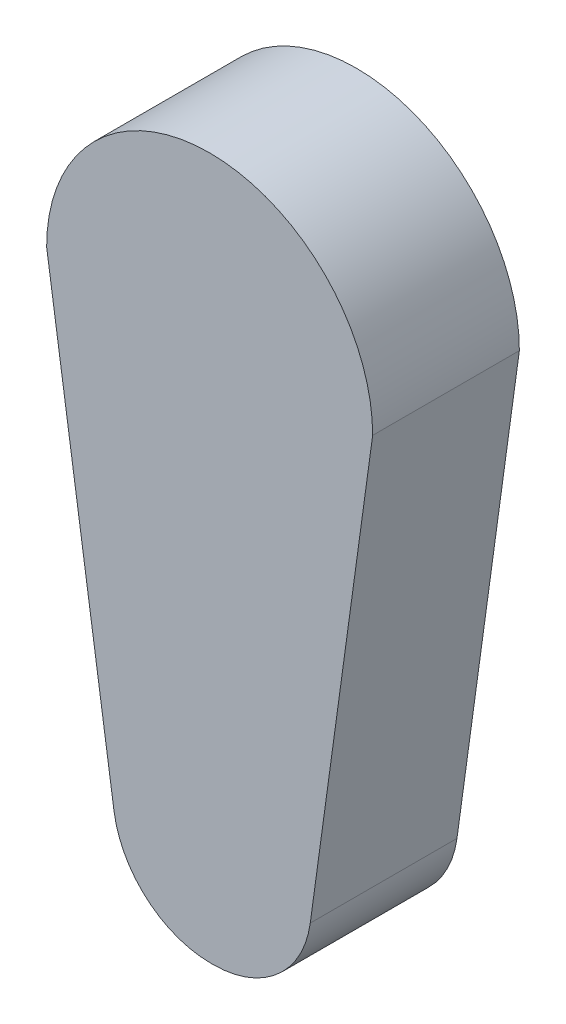
ISO-10303-21;
HEADER;
FILE_DESCRIPTION(('STEP AP214'),'2;1');
FILE_NAME('part.step','',(''),(''),'','','');
FILE_SCHEMA(('AUTOMOTIVE_DESIGN { 1 0 10303 214 1 1 1 1 }'));
ENDSEC;
DATA;
#1=APPLICATION_CONTEXT('core data for automotive mechanical design processes');
#2=APPLICATION_PROTOCOL_DEFINITION('international standard','automotive_design',2000,#1);
#3=PRODUCT_CONTEXT('',#1,'mechanical');
#4=PRODUCT('Part','Part','',(#3));
#5=PRODUCT_RELATED_PRODUCT_CATEGORY('part','',(#4));
#6=PRODUCT_DEFINITION_FORMATION('','',#4);
#7=PRODUCT_DEFINITION_CONTEXT('part definition',#1,'design');
#8=PRODUCT_DEFINITION('design','',#6,#7);
#9=PRODUCT_DEFINITION_SHAPE('','',#8);
#10=(LENGTH_UNIT() NAMED_UNIT(*) SI_UNIT(.MILLI.,.METRE.));
#11=(NAMED_UNIT(*) PLANE_ANGLE_UNIT() SI_UNIT($,.RADIAN.));
#12=(NAMED_UNIT(*) SI_UNIT($,.STERADIAN.) SOLID_ANGLE_UNIT());
#13=UNCERTAINTY_MEASURE_WITH_UNIT(LENGTH_MEASURE(1.E-05),#10,'distance_accuracy_value','');
#14=(GEOMETRIC_REPRESENTATION_CONTEXT(3) GLOBAL_UNCERTAINTY_ASSIGNED_CONTEXT((#13)) GLOBAL_UNIT_ASSIGNED_CONTEXT((#10,
#11,#12)) REPRESENTATION_CONTEXT('',''));
#15=CARTESIAN_POINT('',(0.,0.,0.));
#16=DIRECTION('',(0.,0.,1.));
#17=DIRECTION('',(1.,0.,0.));
#18=AXIS2_PLACEMENT_3D('',#15,#16,#17);
#19=CARTESIAN_POINT('',(-4.93131975717711,6.15468669765734,2.475));
#20=DIRECTION('',(-0.989200897474757,-0.146565972978502,0.));
#21=DIRECTION('',(0.146565972978502,-0.989200897474757,0.));
#22=AXIS2_PLACEMENT_3D('',#19,#20,#21);
#23=PLANE('',#22);
#24=DIRECTION('',(-0.146565972978502,0.989200897474757,0.));
#25=VECTOR('',#24,1.);
#26=CARTESIAN_POINT('',(-4.93131975717711,6.15468669765734,-2.025));
#27=LINE('',#26,#25);
#28=CARTESIAN_POINT('',(-2.97208315950685,-7.06856397502836,-2.025));
#29=VERTEX_POINT('',#28);
#30=CARTESIAN_POINT('',(-5.03872767935279,6.87960265770532,-2.025));
#31=VERTEX_POINT('',#30);
#32=EDGE_CURVE('E181',#29,#31,#27,.T.);
#33=ORIENTED_EDGE('',*,*,#32,.F.);
#34=DIRECTION('',(0.,0.,-1.));
#35=VECTOR('',#34,1.);
#36=CARTESIAN_POINT('',(-2.97208315950685,-7.06856397502835,2.475));
#37=LINE('',#36,#35);
#38=CARTESIAN_POINT('',(-2.97208315950685,-7.06856397502836,2.475));
#39=VERTEX_POINT('',#38);
#40=EDGE_CURVE('E59',#29,#39,#37,.F.);
#41=ORIENTED_EDGE('',*,*,#40,.T.);
#42=DIRECTION('',(-0.146565972978502,0.989200897474757,0.));
#43=VECTOR('',#42,1.);
#44=CARTESIAN_POINT('',(-4.93131975717711,6.15468669765734,2.475));
#45=LINE('',#44,#43);
#46=CARTESIAN_POINT('',(-5.03872767935279,6.87960265770532,2.475));
#47=VERTEX_POINT('',#46);
#48=EDGE_CURVE('E182',#39,#47,#45,.T.);
#49=ORIENTED_EDGE('',*,*,#48,.T.);
#50=DIRECTION('',(0.,0.,-1.));
#51=VECTOR('',#50,1.);
#52=CARTESIAN_POINT('',(-5.03872767935279,6.87960265770532,2.475));
#53=LINE('',#52,#51);
#54=EDGE_CURVE('E190',#47,#31,#53,.T.);
#55=ORIENTED_EDGE('',*,*,#54,.T.);
#56=EDGE_LOOP('',(#33,#41,#49,#55));
#57=FACE_BOUND('',#56,.T.);
#58=ADVANCED_FACE('F36',(#57),#23,.T.);
#59=CARTESIAN_POINT('',(4.8689374188945,6.20456218244334,2.475));
#60=DIRECTION('',(-0.990672395571448,0.136265199712651,0.));
#61=DIRECTION('',(-0.136265199712651,-0.990672395571448,0.));
#62=AXIS2_PLACEMENT_3D('',#59,#60,#61);
#63=PLANE('',#62);
#64=DIRECTION('',(0.136265199712651,0.990672395571448,0.));
#65=VECTOR('',#64,1.);
#66=CARTESIAN_POINT('',(4.8689374188945,6.20456218244334,2.475));
#67=LINE('',#66,#65);
#68=CARTESIAN_POINT('',(3.04749343403466,-7.0376616552308,2.475));
#69=VERTEX_POINT('',#68);
#70=CARTESIAN_POINT('',(4.96127090727384,6.87584317213934,2.475));
#71=VERTEX_POINT('',#70);
#72=EDGE_CURVE('E184',#69,#71,#67,.T.);
#73=ORIENTED_EDGE('',*,*,#72,.F.);
#74=DIRECTION('',(0.,0.,-1.));
#75=VECTOR('',#74,1.);
#76=CARTESIAN_POINT('',(3.04749343403466,-7.0376616552308,2.475));
#77=LINE('',#76,#75);
#78=CARTESIAN_POINT('',(3.04749343403466,-7.0376616552308,-2.025));
#79=VERTEX_POINT('',#78);
#80=EDGE_CURVE('E11',#69,#79,#77,.T.);
#81=ORIENTED_EDGE('',*,*,#80,.T.);
#82=DIRECTION('',(0.136265199712651,0.990672395571448,0.));
#83=VECTOR('',#82,1.);
#84=CARTESIAN_POINT('',(4.8689374188945,6.20456218244334,-2.025));
#85=LINE('',#84,#83);
#86=CARTESIAN_POINT('',(4.96127090727384,6.87584317213934,-2.025));
#87=VERTEX_POINT('',#86);
#88=EDGE_CURVE('E192',#79,#87,#85,.T.);
#89=ORIENTED_EDGE('',*,*,#88,.T.);
#90=DIRECTION('',(0.,0.,-1.));
#91=VECTOR('',#90,1.);
#92=CARTESIAN_POINT('',(4.96127090727384,6.87584317213934,2.475));
#93=LINE('',#92,#91);
#94=EDGE_CURVE('E198',#71,#87,#93,.T.);
#95=ORIENTED_EDGE('',*,*,#94,.F.);
#96=EDGE_LOOP('',(#73,#81,#89,#95));
#97=FACE_BOUND('',#96,.T.);
#98=ADVANCED_FACE('F237',(#97),#63,.F.);
#99=CARTESIAN_POINT('',(-0.0387276793527847,6.87960265770532,2.475));
#100=DIRECTION('',(0.,0.,-1.));
#101=DIRECTION('',(-1.,0.,0.));
#102=AXIS2_PLACEMENT_3D('',#99,#100,#101);
#103=CYLINDRICAL_SURFACE('',#102,5.);
#104=CARTESIAN_POINT('',(-0.0387276793527847,6.87960265770532,-2.025));
#105=DIRECTION('',(0.,0.,1.));
#106=DIRECTION('',(1.,0.,0.));
#107=AXIS2_PLACEMENT_3D('',#104,#105,#106);
#108=CIRCLE('',#107,5.);
#109=EDGE_CURVE('E185',#87,#31,#108,.T.);
#110=ORIENTED_EDGE('',*,*,#109,.T.);
#111=ORIENTED_EDGE('',*,*,#54,.F.);
#112=CARTESIAN_POINT('',(-0.0387276793527847,6.87960265770532,2.475));
#113=DIRECTION('',(0.,0.,1.));
#114=DIRECTION('',(1.,0.,0.));
#115=AXIS2_PLACEMENT_3D('',#112,#113,#114);
#116=CIRCLE('',#115,5.);
#117=EDGE_CURVE('E187',#71,#47,#116,.T.);
#118=ORIENTED_EDGE('',*,*,#117,.F.);
#119=ORIENTED_EDGE('',*,*,#94,.T.);
#120=EDGE_LOOP('',(#110,#111,#118,#119));
#121=FACE_BOUND('',#120,.T.);
#122=ADVANCED_FACE('F233',(#121),#103,.T.);
#123=CARTESIAN_POINT('',(-0.0387276793527847,6.87960265770532,2.475));
#124=DIRECTION('',(0.,0.,1.));
#125=DIRECTION('',(1.,0.,0.));
#126=AXIS2_PLACEMENT_3D('',#123,#124,#125);
#127=PLANE('',#126);
#128=ORIENTED_EDGE('',*,*,#48,.F.);
#129=CARTESIAN_POINT('',(-0.00448046708257516,-6.62886605609285,2.475));
#130=DIRECTION('',(0.,0.,1.));
#131=DIRECTION('',(1.,0.,0.));
#132=AXIS2_PLACEMENT_3D('',#129,#130,#131);
#133=CIRCLE('',#132,3.);
#134=CARTESIAN_POINT('',(-0.00448046708257516,-9.62886605609285,2.475));
#135=VERTEX_POINT('',#134);
#136=EDGE_CURVE('E44',#39,#135,#133,.T.);
#137=ORIENTED_EDGE('',*,*,#136,.T.);
#138=DIRECTION('',(1.,0.,0.));
#139=VECTOR('',#138,1.);
#140=CARTESIAN_POINT('',(2.6917503967597,-9.62886605609285,2.475));
#141=LINE('',#140,#139);
#142=CARTESIAN_POINT('',(0.0754762473203171,-9.62886605609285,2.475));
#143=VERTEX_POINT('',#142);
#144=EDGE_CURVE('E217',#135,#143,#141,.T.);
#145=ORIENTED_EDGE('',*,*,#144,.T.);
#146=CARTESIAN_POINT('',(0.0754762473203171,-6.62886605609285,2.475));
#147=DIRECTION('',(0.,0.,1.));
#148=DIRECTION('',(1.,0.,0.));
#149=AXIS2_PLACEMENT_3D('',#146,#147,#148);
#150=CIRCLE('',#149,3.);
#151=EDGE_CURVE('E51',#143,#69,#150,.T.);
#152=ORIENTED_EDGE('',*,*,#151,.T.);
#153=ORIENTED_EDGE('',*,*,#72,.T.);
#154=ORIENTED_EDGE('',*,*,#117,.T.);
#155=EDGE_LOOP('',(#128,#137,#145,#152,#153,#154));
#156=FACE_BOUND('',#155,.T.);
#157=ADVANCED_FACE('F216',(#156),#127,.T.);
#158=CARTESIAN_POINT('',(-0.0387276793527847,6.87960265770532,-2.025));
#159=DIRECTION('',(0.,0.,1.));
#160=DIRECTION('',(1.,0.,0.));
#161=AXIS2_PLACEMENT_3D('',#158,#159,#160);
#162=PLANE('',#161);
#163=DIRECTION('',(-0.0898786869233803,-0.995952720583125,0.));
#164=VECTOR('',#163,1.);
#165=CARTESIAN_POINT('',(2.77143117718283,4.21576595588987,-2.025));
#166=LINE('',#165,#164);
#167=CARTESIAN_POINT('',(2.77143117718283,4.21576595588987,-2.025));
#168=VERTEX_POINT('',#167);
#169=CARTESIAN_POINT('',(1.6980635868002,-7.67830379992061,-2.025));
#170=VERTEX_POINT('',#169);
#171=EDGE_CURVE('E151',#168,#170,#166,.T.);
#172=ORIENTED_EDGE('',*,*,#171,.F.);
#173=CARTESIAN_POINT('',(-0.0404058570119669,6.41330826108688,-2.025));
#174=DIRECTION('',(0.,0.,-1.));
#175=DIRECTION('',(-1.,0.,0.));
#176=AXIS2_PLACEMENT_3D('',#173,#174,#175);
#177=CIRCLE('',#176,3.5687);
#178=CARTESIAN_POINT('',(-2.85466796517329,4.21887246194228,-2.025));
#179=VERTEX_POINT('',#178);
#180=EDGE_CURVE('E122',#179,#168,#177,.T.);
#181=ORIENTED_EDGE('',*,*,#180,.F.);
#182=DIRECTION('',(-0.0887787822467504,0.99605136806431,0.));
#183=VECTOR('',#182,1.);
#184=CARTESIAN_POINT('',(-1.79443588080235,-7.67637538194224,-2.025));
#185=LINE('',#184,#183);
#186=CARTESIAN_POINT('',(-1.79443588080235,-7.67637538194224,-2.025));
#187=VERTEX_POINT('',#186);
#188=EDGE_CURVE('E139',#187,#179,#185,.T.);
#189=ORIENTED_EDGE('',*,*,#188,.F.);
#190=CARTESIAN_POINT('',(-0.0481861470010723,-7.67733959093142,-2.025));
#191=DIRECTION('',(0.,0.,-1.));
#192=DIRECTION('',(-1.,0.,0.));
#193=AXIS2_PLACEMENT_3D('',#190,#191,#192);
#194=CIRCLE('',#193,1.74625);
#195=EDGE_CURVE('E142',#170,#187,#194,.T.);
#196=ORIENTED_EDGE('',*,*,#195,.F.);
#197=EDGE_LOOP('',(#172,#181,#189,#196));
#198=FACE_BOUND('',#197,.T.);
#199=DIRECTION('',(-1.,0.,0.));
#200=VECTOR('',#199,1.);
#201=CARTESIAN_POINT('',(-0.0387276793527847,-9.62886605609285,-2.025));
#202=LINE('',#201,#200);
#203=CARTESIAN_POINT('',(0.0754762473203171,-9.62886605609285,-2.025));
#204=VERTEX_POINT('',#203);
#205=CARTESIAN_POINT('',(-0.00448046708257516,-9.62886605609285,-2.025));
#206=VERTEX_POINT('',#205);
#207=EDGE_CURVE('E201',#204,#206,#202,.T.);
#208=ORIENTED_EDGE('',*,*,#207,.T.);
#209=CARTESIAN_POINT('',(-0.00448046708257516,-6.62886605609285,-2.025));
#210=DIRECTION('',(0.,0.,1.));
#211=DIRECTION('',(1.,0.,0.));
#212=AXIS2_PLACEMENT_3D('',#209,#210,#211);
#213=CIRCLE('',#212,3.);
#214=EDGE_CURVE('E211',#206,#29,#213,.F.);
#215=ORIENTED_EDGE('',*,*,#214,.T.);
#216=ORIENTED_EDGE('',*,*,#32,.T.);
#217=ORIENTED_EDGE('',*,*,#109,.F.);
#218=ORIENTED_EDGE('',*,*,#88,.F.);
#219=CARTESIAN_POINT('',(0.0754762473203171,-6.62886605609285,-2.025));
#220=DIRECTION('',(0.,0.,1.));
#221=DIRECTION('',(1.,0.,0.));
#222=AXIS2_PLACEMENT_3D('',#219,#220,#221);
#223=CIRCLE('',#222,3.);
#224=EDGE_CURVE('E209',#79,#204,#223,.F.);
#225=ORIENTED_EDGE('',*,*,#224,.T.);
#226=EDGE_LOOP('',(#208,#215,#216,#217,#218,#225));
#227=FACE_BOUND('',#226,.T.);
#228=ADVANCED_FACE('F228',(#198,#227),#162,.F.);
#229=CARTESIAN_POINT('',(-0.0404058570119669,6.41330826108688,0.475));
#230=DIRECTION('',(0.,0.,-1.));
#231=DIRECTION('',(-1.,0.,0.));
#232=AXIS2_PLACEMENT_3D('',#229,#230,#231);
#233=CYLINDRICAL_SURFACE('',#232,3.5687);
#234=ORIENTED_EDGE('',*,*,#180,.T.);
#235=DIRECTION('',(0.,0.,-1.));
#236=VECTOR('',#235,1.);
#237=CARTESIAN_POINT('',(2.77143117718283,4.21576595588987,0.475));
#238=LINE('',#237,#236);
#239=CARTESIAN_POINT('',(2.77143117718283,4.21576595588987,0.475));
#240=VERTEX_POINT('',#239);
#241=EDGE_CURVE('E115',#240,#168,#238,.T.);
#242=ORIENTED_EDGE('',*,*,#241,.F.);
#243=CARTESIAN_POINT('',(-0.0404058570119669,6.41330826108688,0.475));
#244=DIRECTION('',(0.,0.,-1.));
#245=DIRECTION('',(-1.,0.,0.));
#246=AXIS2_PLACEMENT_3D('',#243,#244,#245);
#247=CIRCLE('',#246,3.5687);
#248=CARTESIAN_POINT('',(-2.85466796517329,4.21887246194228,0.475));
#249=VERTEX_POINT('',#248);
#250=EDGE_CURVE('E119',#249,#240,#247,.T.);
#251=ORIENTED_EDGE('',*,*,#250,.F.);
#252=DIRECTION('',(0.,0.,-1.));
#253=VECTOR('',#252,1.);
#254=CARTESIAN_POINT('',(-2.85466796517329,4.21887246194228,0.475));
#255=LINE('',#254,#253);
#256=EDGE_CURVE('E155',#249,#179,#255,.T.);
#257=ORIENTED_EDGE('',*,*,#256,.T.);
#258=EDGE_LOOP('',(#234,#242,#251,#257));
#259=FACE_BOUND('',#258,.T.);
#260=ADVANCED_FACE('F117',(#259),#233,.F.);
#261=CARTESIAN_POINT('',(-1.79443588080235,-7.67637538194224,0.475));
#262=DIRECTION('',(-0.99605136806431,-0.0887787822467504,0.));
#263=DIRECTION('',(0.0887787822467504,-0.99605136806431,0.));
#264=AXIS2_PLACEMENT_3D('',#261,#262,#263);
#265=PLANE('',#264);
#266=ORIENTED_EDGE('',*,*,#188,.T.);
#267=ORIENTED_EDGE('',*,*,#256,.F.);
#268=DIRECTION('',(-0.0887787822467504,0.99605136806431,0.));
#269=VECTOR('',#268,1.);
#270=CARTESIAN_POINT('',(-1.79443588080235,-7.67637538194224,0.475));
#271=LINE('',#270,#269);
#272=CARTESIAN_POINT('',(-1.79443588080235,-7.67637538194224,0.475));
#273=VERTEX_POINT('',#272);
#274=EDGE_CURVE('E127',#273,#249,#271,.T.);
#275=ORIENTED_EDGE('',*,*,#274,.F.);
#276=DIRECTION('',(0.,0.,-1.));
#277=VECTOR('',#276,1.);
#278=CARTESIAN_POINT('',(-1.79443588080235,-7.67637538194224,0.475));
#279=LINE('',#278,#277);
#280=EDGE_CURVE('E158',#273,#187,#279,.T.);
#281=ORIENTED_EDGE('',*,*,#280,.T.);
#282=EDGE_LOOP('',(#266,#267,#275,#281));
#283=FACE_BOUND('',#282,.T.);
#284=ADVANCED_FACE('F316',(#283),#265,.F.);
#285=CARTESIAN_POINT('',(-0.0481861470010723,-7.67733959093142,0.475));
#286=DIRECTION('',(0.,0.,-1.));
#287=DIRECTION('',(-1.,0.,0.));
#288=AXIS2_PLACEMENT_3D('',#285,#286,#287);
#289=CYLINDRICAL_SURFACE('',#288,1.74625);
#290=ORIENTED_EDGE('',*,*,#195,.T.);
#291=ORIENTED_EDGE('',*,*,#280,.F.);
#292=CARTESIAN_POINT('',(-0.0481861470010723,-7.67733959093142,0.475));
#293=DIRECTION('',(0.,0.,-1.));
#294=DIRECTION('',(-1.,0.,0.));
#295=AXIS2_PLACEMENT_3D('',#292,#293,#294);
#296=CIRCLE('',#295,1.74625);
#297=CARTESIAN_POINT('',(1.6980635868002,-7.67830379992061,0.475));
#298=VERTEX_POINT('',#297);
#299=EDGE_CURVE('E135',#298,#273,#296,.T.);
#300=ORIENTED_EDGE('',*,*,#299,.F.);
#301=DIRECTION('',(0.,0.,-1.));
#302=VECTOR('',#301,1.);
#303=CARTESIAN_POINT('',(1.6980635868002,-7.67830379992061,0.475));
#304=LINE('',#303,#302);
#305=EDGE_CURVE('E126',#298,#170,#304,.T.);
#306=ORIENTED_EDGE('',*,*,#305,.T.);
#307=EDGE_LOOP('',(#290,#291,#300,#306));
#308=FACE_BOUND('',#307,.T.);
#309=ADVANCED_FACE('F319',(#308),#289,.F.);
#310=CARTESIAN_POINT('',(2.77143117718283,4.21576595588987,0.475));
#311=DIRECTION('',(0.995952720583125,-0.0898786869233803,0.));
#312=DIRECTION('',(0.0898786869233803,0.995952720583125,0.));
#313=AXIS2_PLACEMENT_3D('',#310,#311,#312);
#314=PLANE('',#313);
#315=ORIENTED_EDGE('',*,*,#171,.T.);
#316=ORIENTED_EDGE('',*,*,#305,.F.);
#317=DIRECTION('',(-0.0898786869233803,-0.995952720583125,0.));
#318=VECTOR('',#317,1.);
#319=CARTESIAN_POINT('',(2.77143117718283,4.21576595588987,0.475));
#320=LINE('',#319,#318);
#321=EDGE_CURVE('E130',#240,#298,#320,.T.);
#322=ORIENTED_EDGE('',*,*,#321,.F.);
#323=ORIENTED_EDGE('',*,*,#241,.T.);
#324=EDGE_LOOP('',(#315,#316,#322,#323));
#325=FACE_BOUND('',#324,.T.);
#326=ADVANCED_FACE('F131',(#325),#314,.F.);
#327=CARTESIAN_POINT('',(-0.0404058570119669,6.41330826108688,0.475));
#328=DIRECTION('',(0.,0.,-1.));
#329=DIRECTION('',(-1.,0.,0.));
#330=AXIS2_PLACEMENT_3D('',#327,#328,#329);
#331=PLANE('',#330);
#332=CARTESIAN_POINT('',(-0.0404058570119669,6.41330826108688,0.475));
#333=DIRECTION('',(0.,0.,-1.));
#334=DIRECTION('',(-1.,0.,0.));
#335=AXIS2_PLACEMENT_3D('',#332,#333,#334);
#336=CIRCLE('',#335,2.);
#337=CARTESIAN_POINT('',(-2.04040585701197,6.41330826108688,0.475));
#338=VERTEX_POINT('',#337);
#339=EDGE_CURVE('E224',#338,#338,#336,.T.);
#340=ORIENTED_EDGE('',*,*,#339,.F.);
#341=EDGE_LOOP('',(#340));
#342=FACE_BOUND('',#341,.T.);
#343=CARTESIAN_POINT('',(-0.048480669019588,-8.2107395096198,0.475));
#344=DIRECTION('',(0.,0.,-1.));
#345=DIRECTION('',(-1.,0.,0.));
#346=AXIS2_PLACEMENT_3D('',#343,#344,#345);
#347=CIRCLE('',#346,0.533399999999998);
#348=CARTESIAN_POINT('',(-0.581880669019586,-8.2107395096198,0.475));
#349=VERTEX_POINT('',#348);
#350=EDGE_CURVE('E500',#349,#349,#347,.T.);
#351=ORIENTED_EDGE('',*,*,#350,.F.);
#352=EDGE_LOOP('',(#351));
#353=FACE_BOUND('',#352,.T.);
#354=CARTESIAN_POINT('',(-0.0475410035319515,-6.50893976904257,0.475));
#355=DIRECTION('',(0.,0.,-1.));
#356=DIRECTION('',(-1.,0.,0.));
#357=AXIS2_PLACEMENT_3D('',#354,#355,#356);
#358=CIRCLE('',#357,0.533399999999999);
#359=CARTESIAN_POINT('',(-0.58094100353195,-6.50893976904257,0.475));
#360=VERTEX_POINT('',#359);
#361=EDGE_CURVE('E504',#360,#360,#358,.T.);
#362=ORIENTED_EDGE('',*,*,#361,.F.);
#363=EDGE_LOOP('',(#362));
#364=FACE_BOUND('',#363,.T.);
#365=CARTESIAN_POINT('',(-0.0466013380443142,-4.80714002846532,0.475));
#366=DIRECTION('',(0.,0.,-1.));
#367=DIRECTION('',(-1.,0.,0.));
#368=AXIS2_PLACEMENT_3D('',#365,#366,#367);
#369=CIRCLE('',#368,0.533399999999999);
#370=CARTESIAN_POINT('',(-0.580001338044313,-4.80714002846532,0.475));
#371=VERTEX_POINT('',#370);
#372=EDGE_CURVE('E508',#371,#371,#369,.T.);
#373=ORIENTED_EDGE('',*,*,#372,.F.);
#374=EDGE_LOOP('',(#373));
#375=FACE_BOUND('',#374,.T.);
#376=CARTESIAN_POINT('',(-0.0456616725566777,-3.10534028788807,0.475));
#377=DIRECTION('',(0.,0.,-1.));
#378=DIRECTION('',(-1.,0.,0.));
#379=AXIS2_PLACEMENT_3D('',#376,#377,#378);
#380=CIRCLE('',#379,0.533399999999999);
#381=CARTESIAN_POINT('',(-0.579061672556677,-3.10534028788807,0.475));
#382=VERTEX_POINT('',#381);
#383=EDGE_CURVE('E512',#382,#382,#380,.T.);
#384=ORIENTED_EDGE('',*,*,#383,.F.);
#385=EDGE_LOOP('',(#384));
#386=FACE_BOUND('',#385,.T.);
#387=CARTESIAN_POINT('',(-0.0447220070690325,-1.40354054731083,0.475));
#388=DIRECTION('',(0.,0.,-1.));
#389=DIRECTION('',(-1.,0.,0.));
#390=AXIS2_PLACEMENT_3D('',#387,#388,#389);
#391=CIRCLE('',#390,0.533399999999998);
#392=CARTESIAN_POINT('',(-0.578122007069031,-1.40354054731083,0.475));
#393=VERTEX_POINT('',#392);
#394=EDGE_CURVE('E516',#393,#393,#391,.T.);
#395=ORIENTED_EDGE('',*,*,#394,.F.);
#396=EDGE_LOOP('',(#395));
#397=FACE_BOUND('',#396,.T.);
#398=CARTESIAN_POINT('',(-0.043782341581396,0.298259193266405,0.475));
#399=DIRECTION('',(0.,0.,-1.));
#400=DIRECTION('',(-1.,0.,0.));
#401=AXIS2_PLACEMENT_3D('',#398,#399,#400);
#402=CIRCLE('',#401,0.533399999999999);
#403=CARTESIAN_POINT('',(-0.577182341581395,0.298259193266405,0.475));
#404=VERTEX_POINT('',#403);
#405=EDGE_CURVE('E145',#404,#404,#402,.T.);
#406=ORIENTED_EDGE('',*,*,#405,.F.);
#407=EDGE_LOOP('',(#406));
#408=FACE_BOUND('',#407,.T.);
#409=ORIENTED_EDGE('',*,*,#250,.T.);
#410=ORIENTED_EDGE('',*,*,#321,.T.);
#411=ORIENTED_EDGE('',*,*,#299,.T.);
#412=ORIENTED_EDGE('',*,*,#274,.T.);
#413=EDGE_LOOP('',(#409,#410,#411,#412));
#414=FACE_BOUND('',#413,.T.);
#415=ADVANCED_FACE('F137',(#342,#353,#364,#375,#386,#397,#408,#414),#331,.T.);
#416=CARTESIAN_POINT('',(-0.0404058570119669,6.41330826108688,0.915));
#417=DIRECTION('',(0.,0.,-1.));
#418=DIRECTION('',(-1.,0.,0.));
#419=AXIS2_PLACEMENT_3D('',#416,#417,#418);
#420=PLANE('',#419);
#421=CARTESIAN_POINT('',(-0.0404058570119669,6.41330826108688,0.915));
#422=DIRECTION('',(0.,0.,-1.));
#423=DIRECTION('',(-1.,0.,0.));
#424=AXIS2_PLACEMENT_3D('',#421,#422,#423);
#425=CIRCLE('',#424,2.);
#426=CARTESIAN_POINT('',(-2.04040585701197,6.41330826108688,0.915));
#427=VERTEX_POINT('',#426);
#428=EDGE_CURVE('E171',#427,#427,#425,.T.);
#429=ORIENTED_EDGE('',*,*,#428,.T.);
#430=EDGE_LOOP('',(#429));
#431=FACE_BOUND('',#430,.T.);
#432=ADVANCED_FACE('F286',(#431),#420,.T.);
#433=CARTESIAN_POINT('',(-0.0404058570119669,6.41330826108688,0.915));
#434=DIRECTION('',(0.,0.,-1.));
#435=DIRECTION('',(-1.,0.,0.));
#436=AXIS2_PLACEMENT_3D('',#433,#434,#435);
#437=CYLINDRICAL_SURFACE('',#436,2.);
#438=ORIENTED_EDGE('',*,*,#428,.F.);
#439=EDGE_LOOP('',(#438));
#440=FACE_BOUND('',#439,.T.);
#441=ORIENTED_EDGE('',*,*,#339,.T.);
#442=EDGE_LOOP('',(#441));
#443=FACE_BOUND('',#442,.T.);
#444=ADVANCED_FACE('F281',(#440,#443),#437,.F.);
#445=CARTESIAN_POINT('',(-0.048480669019588,-8.2107395096198,0.915));
#446=DIRECTION('',(0.,0.,-1.));
#447=DIRECTION('',(-1.,0.,0.));
#448=AXIS2_PLACEMENT_3D('',#445,#446,#447);
#449=PLANE('',#448);
#450=CARTESIAN_POINT('',(-0.048480669019588,-8.2107395096198,0.915));
#451=DIRECTION('',(0.,0.,-1.));
#452=DIRECTION('',(-1.,0.,0.));
#453=AXIS2_PLACEMENT_3D('',#450,#451,#452);
#454=CIRCLE('',#453,0.533399999999998);
#455=CARTESIAN_POINT('',(-0.581880669019586,-8.2107395096198,0.915));
#456=VERTEX_POINT('',#455);
#457=EDGE_CURVE('E174',#456,#456,#454,.T.);
#458=ORIENTED_EDGE('',*,*,#457,.T.);
#459=EDGE_LOOP('',(#458));
#460=FACE_BOUND('',#459,.T.);
#461=ADVANCED_FACE('F278',(#460),#449,.T.);
#462=CARTESIAN_POINT('',(-0.048480669019588,-8.2107395096198,0.915));
#463=DIRECTION('',(0.,0.,-1.));
#464=DIRECTION('',(-1.,0.,0.));
#465=AXIS2_PLACEMENT_3D('',#462,#463,#464);
#466=CYLINDRICAL_SURFACE('',#465,0.533399999999998);
#467=ORIENTED_EDGE('',*,*,#457,.F.);
#468=EDGE_LOOP('',(#467));
#469=FACE_BOUND('',#468,.T.);
#470=ORIENTED_EDGE('',*,*,#350,.T.);
#471=EDGE_LOOP('',(#470));
#472=FACE_BOUND('',#471,.T.);
#473=ADVANCED_FACE('F272',(#469,#472),#466,.F.);
#474=CARTESIAN_POINT('',(-0.0475410035319515,-6.50893976904257,0.915));
#475=DIRECTION('',(0.,0.,-1.));
#476=DIRECTION('',(-1.,0.,0.));
#477=AXIS2_PLACEMENT_3D('',#474,#475,#476);
#478=PLANE('',#477);
#479=CARTESIAN_POINT('',(-0.0475410035319515,-6.50893976904257,0.915));
#480=DIRECTION('',(0.,0.,-1.));
#481=DIRECTION('',(-1.,0.,0.));
#482=AXIS2_PLACEMENT_3D('',#479,#480,#481);
#483=CIRCLE('',#482,0.533399999999999);
#484=CARTESIAN_POINT('',(-0.58094100353195,-6.50893976904257,0.915));
#485=VERTEX_POINT('',#484);
#486=EDGE_CURVE('E164',#485,#485,#483,.T.);
#487=ORIENTED_EDGE('',*,*,#486,.T.);
#488=EDGE_LOOP('',(#487));
#489=FACE_BOUND('',#488,.T.);
#490=ADVANCED_FACE('F268',(#489),#478,.T.);
#491=CARTESIAN_POINT('',(-0.0475410035319515,-6.50893976904257,0.915));
#492=DIRECTION('',(0.,0.,-1.));
#493=DIRECTION('',(-1.,0.,0.));
#494=AXIS2_PLACEMENT_3D('',#491,#492,#493);
#495=CYLINDRICAL_SURFACE('',#494,0.533399999999999);
#496=ORIENTED_EDGE('',*,*,#486,.F.);
#497=EDGE_LOOP('',(#496));
#498=FACE_BOUND('',#497,.T.);
#499=ORIENTED_EDGE('',*,*,#361,.T.);
#500=EDGE_LOOP('',(#499));
#501=FACE_BOUND('',#500,.T.);
#502=ADVANCED_FACE('F271',(#498,#501),#495,.F.);
#503=CARTESIAN_POINT('',(-0.0466013380443142,-4.80714002846532,0.915));
#504=DIRECTION('',(0.,0.,-1.));
#505=DIRECTION('',(-1.,0.,0.));
#506=AXIS2_PLACEMENT_3D('',#503,#504,#505);
#507=PLANE('',#506);
#508=CARTESIAN_POINT('',(-0.0466013380443142,-4.80714002846532,0.915));
#509=DIRECTION('',(0.,0.,-1.));
#510=DIRECTION('',(-1.,0.,0.));
#511=AXIS2_PLACEMENT_3D('',#508,#509,#510);
#512=CIRCLE('',#511,0.533399999999999);
#513=CARTESIAN_POINT('',(-0.580001338044313,-4.80714002846532,0.915));
#514=VERTEX_POINT('',#513);
#515=EDGE_CURVE('E161',#514,#514,#512,.T.);
#516=ORIENTED_EDGE('',*,*,#515,.T.);
#517=EDGE_LOOP('',(#516));
#518=FACE_BOUND('',#517,.T.);
#519=ADVANCED_FACE('F276',(#518),#507,.T.);
#520=CARTESIAN_POINT('',(-0.0466013380443142,-4.80714002846532,0.915));
#521=DIRECTION('',(0.,0.,-1.));
#522=DIRECTION('',(-1.,0.,0.));
#523=AXIS2_PLACEMENT_3D('',#520,#521,#522);
#524=CYLINDRICAL_SURFACE('',#523,0.533399999999999);
#525=ORIENTED_EDGE('',*,*,#515,.F.);
#526=EDGE_LOOP('',(#525));
#527=FACE_BOUND('',#526,.T.);
#528=ORIENTED_EDGE('',*,*,#372,.T.);
#529=EDGE_LOOP('',(#528));
#530=FACE_BOUND('',#529,.T.);
#531=ADVANCED_FACE('F303',(#527,#530),#524,.F.);
#532=CARTESIAN_POINT('',(-0.0456616725566777,-3.10534028788807,0.915));
#533=DIRECTION('',(0.,0.,-1.));
#534=DIRECTION('',(-1.,0.,0.));
#535=AXIS2_PLACEMENT_3D('',#532,#533,#534);
#536=PLANE('',#535);
#537=CARTESIAN_POINT('',(-0.0456616725566777,-3.10534028788807,0.915));
#538=DIRECTION('',(0.,0.,-1.));
#539=DIRECTION('',(-1.,0.,0.));
#540=AXIS2_PLACEMENT_3D('',#537,#538,#539);
#541=CIRCLE('',#540,0.533399999999999);
#542=CARTESIAN_POINT('',(-0.579061672556677,-3.10534028788807,0.915));
#543=VERTEX_POINT('',#542);
#544=EDGE_CURVE('E157',#543,#543,#541,.T.);
#545=ORIENTED_EDGE('',*,*,#544,.T.);
#546=EDGE_LOOP('',(#545));
#547=FACE_BOUND('',#546,.T.);
#548=ADVANCED_FACE('F300',(#547),#536,.T.);
#549=CARTESIAN_POINT('',(-0.0456616725566777,-3.10534028788807,0.915));
#550=DIRECTION('',(0.,0.,-1.));
#551=DIRECTION('',(-1.,0.,0.));
#552=AXIS2_PLACEMENT_3D('',#549,#550,#551);
#553=CYLINDRICAL_SURFACE('',#552,0.533399999999999);
#554=ORIENTED_EDGE('',*,*,#544,.F.);
#555=EDGE_LOOP('',(#554));
#556=FACE_BOUND('',#555,.T.);
#557=ORIENTED_EDGE('',*,*,#383,.T.);
#558=EDGE_LOOP('',(#557));
#559=FACE_BOUND('',#558,.T.);
#560=ADVANCED_FACE('F266',(#556,#559),#553,.F.);
#561=CARTESIAN_POINT('',(-0.0447220070690325,-1.40354054731083,0.915));
#562=DIRECTION('',(0.,0.,-1.));
#563=DIRECTION('',(-1.,0.,0.));
#564=AXIS2_PLACEMENT_3D('',#561,#562,#563);
#565=PLANE('',#564);
#566=CARTESIAN_POINT('',(-0.0447220070690325,-1.40354054731083,0.915));
#567=DIRECTION('',(0.,0.,-1.));
#568=DIRECTION('',(-1.,0.,0.));
#569=AXIS2_PLACEMENT_3D('',#566,#567,#568);
#570=CIRCLE('',#569,0.533399999999998);
#571=CARTESIAN_POINT('',(-0.578122007069031,-1.40354054731083,0.915));
#572=VERTEX_POINT('',#571);
#573=EDGE_CURVE('E170',#572,#572,#570,.T.);
#574=ORIENTED_EDGE('',*,*,#573,.T.);
#575=EDGE_LOOP('',(#574));
#576=FACE_BOUND('',#575,.T.);
#577=ADVANCED_FACE('F262',(#576),#565,.T.);
#578=CARTESIAN_POINT('',(-0.0447220070690325,-1.40354054731083,0.915));
#579=DIRECTION('',(0.,0.,-1.));
#580=DIRECTION('',(-1.,0.,0.));
#581=AXIS2_PLACEMENT_3D('',#578,#579,#580);
#582=CYLINDRICAL_SURFACE('',#581,0.533399999999998);
#583=ORIENTED_EDGE('',*,*,#573,.F.);
#584=EDGE_LOOP('',(#583));
#585=FACE_BOUND('',#584,.T.);
#586=ORIENTED_EDGE('',*,*,#394,.T.);
#587=EDGE_LOOP('',(#586));
#588=FACE_BOUND('',#587,.T.);
#589=ADVANCED_FACE('F258',(#585,#588),#582,.F.);
#590=CARTESIAN_POINT('',(-0.043782341581396,0.298259193266405,0.915));
#591=DIRECTION('',(0.,0.,-1.));
#592=DIRECTION('',(-1.,0.,0.));
#593=AXIS2_PLACEMENT_3D('',#590,#591,#592);
#594=PLANE('',#593);
#595=CARTESIAN_POINT('',(-0.043782341581396,0.298259193266405,0.915));
#596=DIRECTION('',(0.,0.,-1.));
#597=DIRECTION('',(-1.,0.,0.));
#598=AXIS2_PLACEMENT_3D('',#595,#596,#597);
#599=CIRCLE('',#598,0.533399999999999);
#600=CARTESIAN_POINT('',(-0.577182341581395,0.298259193266405,0.915));
#601=VERTEX_POINT('',#600);
#602=EDGE_CURVE('E167',#601,#601,#599,.T.);
#603=ORIENTED_EDGE('',*,*,#602,.T.);
#604=EDGE_LOOP('',(#603));
#605=FACE_BOUND('',#604,.T.);
#606=ADVANCED_FACE('F261',(#605),#594,.T.);
#607=CARTESIAN_POINT('',(-0.043782341581396,0.298259193266405,0.915));
#608=DIRECTION('',(0.,0.,-1.));
#609=DIRECTION('',(-1.,0.,0.));
#610=AXIS2_PLACEMENT_3D('',#607,#608,#609);
#611=CYLINDRICAL_SURFACE('',#610,0.533399999999999);
#612=ORIENTED_EDGE('',*,*,#602,.F.);
#613=EDGE_LOOP('',(#612));
#614=FACE_BOUND('',#613,.T.);
#615=ORIENTED_EDGE('',*,*,#405,.T.);
#616=EDGE_LOOP('',(#615));
#617=FACE_BOUND('',#616,.T.);
#618=ADVANCED_FACE('F295',(#614,#617),#611,.F.);
#619=CARTESIAN_POINT('',(2.6917503967597,-9.62886605609285,2.475));
#620=DIRECTION('',(0.,1.,0.));
#621=DIRECTION('',(0.,0.,1.));
#622=AXIS2_PLACEMENT_3D('',#619,#620,#621);
#623=PLANE('',#622);
#624=ORIENTED_EDGE('',*,*,#144,.F.);
#625=DIRECTION('',(0.,0.,-1.));
#626=VECTOR('',#625,1.);
#627=CARTESIAN_POINT('',(-0.00448046708257516,-9.62886605609285,-2.025));
#628=LINE('',#627,#626);
#629=EDGE_CURVE('E206',#135,#206,#628,.T.);
#630=ORIENTED_EDGE('',*,*,#629,.T.);
#631=ORIENTED_EDGE('',*,*,#207,.F.);
#632=DIRECTION('',(0.,0.,-1.));
#633=VECTOR('',#632,1.);
#634=CARTESIAN_POINT('',(0.0754762473203171,-9.62886605609285,2.475));
#635=LINE('',#634,#633);
#636=EDGE_CURVE('E204',#204,#143,#635,.F.);
#637=ORIENTED_EDGE('',*,*,#636,.T.);
#638=EDGE_LOOP('',(#624,#630,#631,#637));
#639=FACE_BOUND('',#638,.T.);
#640=ADVANCED_FACE('F221',(#639),#623,.F.);
#641=CARTESIAN_POINT('',(-0.00448046708257516,-6.62886605609285,2.475));
#642=DIRECTION('',(0.,0.,1.));
#643=DIRECTION('',(1.,0.,0.));
#644=AXIS2_PLACEMENT_3D('',#641,#642,#643);
#645=CYLINDRICAL_SURFACE('',#644,3.);
#646=ORIENTED_EDGE('',*,*,#136,.F.);
#647=ORIENTED_EDGE('',*,*,#40,.F.);
#648=ORIENTED_EDGE('',*,*,#214,.F.);
#649=ORIENTED_EDGE('',*,*,#629,.F.);
#650=EDGE_LOOP('',(#646,#647,#648,#649));
#651=FACE_BOUND('',#650,.T.);
#652=ADVANCED_FACE('F226',(#651),#645,.T.);
#653=CARTESIAN_POINT('',(0.0754762473203171,-6.62886605609285,2.475));
#654=DIRECTION('',(0.,0.,-1.));
#655=DIRECTION('',(-1.,0.,0.));
#656=AXIS2_PLACEMENT_3D('',#653,#654,#655);
#657=CYLINDRICAL_SURFACE('',#656,3.);
#658=ORIENTED_EDGE('',*,*,#151,.F.);
#659=ORIENTED_EDGE('',*,*,#636,.F.);
#660=ORIENTED_EDGE('',*,*,#224,.F.);
#661=ORIENTED_EDGE('',*,*,#80,.F.);
#662=EDGE_LOOP('',(#658,#659,#660,#661));
#663=FACE_BOUND('',#662,.T.);
#664=ADVANCED_FACE('F38',(#663),#657,.T.);
#665=CLOSED_SHELL('',(#58,#98,#122,#157,#228,#260,#284,#309,#326,#415,#432,#444,#461,#473,#490,
#502,#519,#531,#548,#560,#577,#589,#606,#618,#640,#652,#664));
#666=MANIFOLD_SOLID_BREP('B2',#665);
#667=ADVANCED_BREP_SHAPE_REPRESENTATION('',(#18,#666),#14);
#668=SHAPE_DEFINITION_REPRESENTATION(#9,#667);
ENDSEC;
END-ISO-10303-21;
